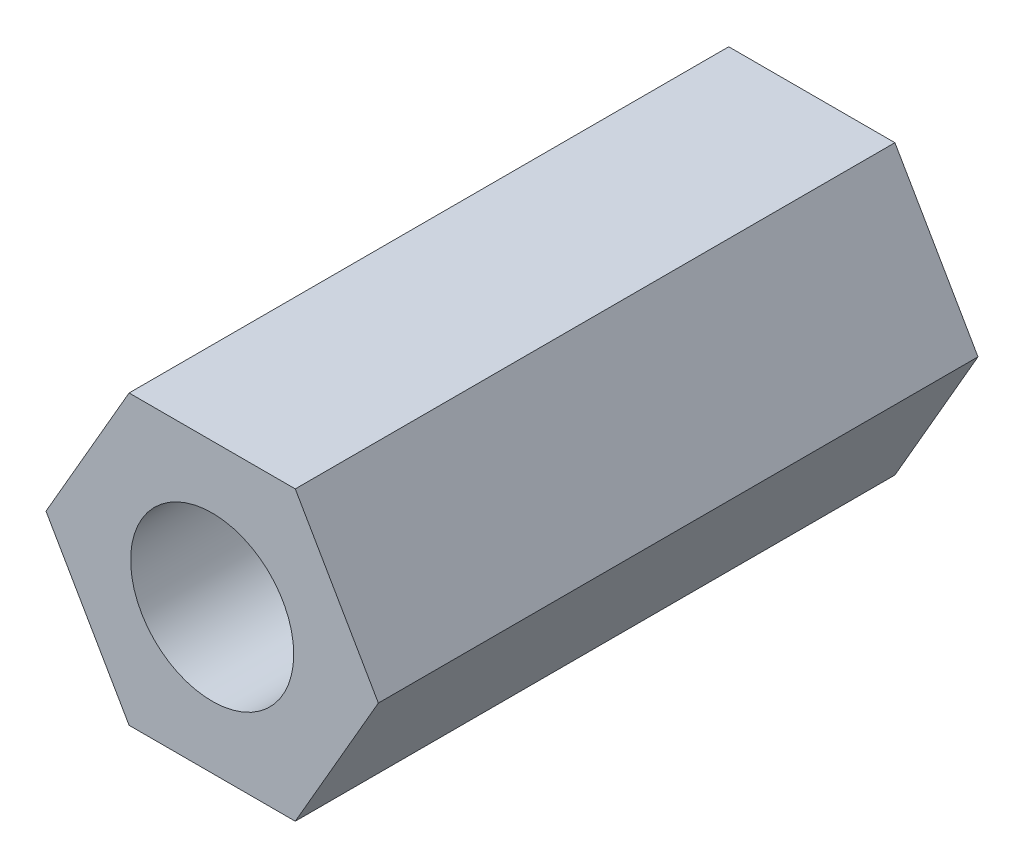
ISO-10303-21;
HEADER;
FILE_DESCRIPTION(('STEP AP214'),'2;1');
FILE_NAME('part.step','',(''),(''),'','','');
FILE_SCHEMA(('AUTOMOTIVE_DESIGN { 1 0 10303 214 1 1 1 1 }'));
ENDSEC;
DATA;
#1=APPLICATION_CONTEXT('core data for automotive mechanical design processes');
#2=APPLICATION_PROTOCOL_DEFINITION('international standard','automotive_design',2000,#1);
#3=PRODUCT_CONTEXT('',#1,'mechanical');
#4=PRODUCT('Part','Part','',(#3));
#5=PRODUCT_RELATED_PRODUCT_CATEGORY('part','',(#4));
#6=PRODUCT_DEFINITION_FORMATION('','',#4);
#7=PRODUCT_DEFINITION_CONTEXT('part definition',#1,'design');
#8=PRODUCT_DEFINITION('design','',#6,#7);
#9=PRODUCT_DEFINITION_SHAPE('','',#8);
#10=(LENGTH_UNIT() NAMED_UNIT(*) SI_UNIT(.MILLI.,.METRE.));
#11=(NAMED_UNIT(*) PLANE_ANGLE_UNIT() SI_UNIT($,.RADIAN.));
#12=(NAMED_UNIT(*) SI_UNIT($,.STERADIAN.) SOLID_ANGLE_UNIT());
#13=UNCERTAINTY_MEASURE_WITH_UNIT(LENGTH_MEASURE(1.E-05),#10,'distance_accuracy_value','');
#14=(GEOMETRIC_REPRESENTATION_CONTEXT(3) GLOBAL_UNCERTAINTY_ASSIGNED_CONTEXT((#13)) GLOBAL_UNIT_ASSIGNED_CONTEXT((#10,
#11,#12)) REPRESENTATION_CONTEXT('',''));
#15=CARTESIAN_POINT('',(0.,0.,0.));
#16=DIRECTION('',(0.,0.,1.));
#17=DIRECTION('',(1.,0.,0.));
#18=AXIS2_PLACEMENT_3D('',#15,#16,#17);
#19=CARTESIAN_POINT('',(3.46410161513775,-6.,-25.));
#20=DIRECTION('',(0.866025403784438,-0.5,0.));
#21=DIRECTION('',(0.5,0.866025403784439,0.));
#22=AXIS2_PLACEMENT_3D('',#19,#20,#21);
#23=PLANE('',#22);
#24=DIRECTION('',(0.5,0.866025403784438,0.));
#25=VECTOR('',#24,1.);
#26=CARTESIAN_POINT('',(3.46410161513775,-6.,0.));
#27=LINE('',#26,#25);
#28=CARTESIAN_POINT('',(3.46410161513775,-6.,0.));
#29=VERTEX_POINT('',#28);
#30=CARTESIAN_POINT('',(6.92820323027551,0.,0.));
#31=VERTEX_POINT('',#30);
#32=EDGE_CURVE('E131',#29,#31,#27,.T.);
#33=ORIENTED_EDGE('',*,*,#32,.F.);
#34=DIRECTION('',(0.,0.,1.));
#35=VECTOR('',#34,1.);
#36=CARTESIAN_POINT('',(3.46410161513775,-6.,-25.));
#37=LINE('',#36,#35);
#38=CARTESIAN_POINT('',(3.46410161513775,-6.,-25.));
#39=VERTEX_POINT('',#38);
#40=EDGE_CURVE('E11',#39,#29,#37,.T.);
#41=ORIENTED_EDGE('',*,*,#40,.F.);
#42=DIRECTION('',(0.5,0.866025403784438,0.));
#43=VECTOR('',#42,1.);
#44=CARTESIAN_POINT('',(3.46410161513775,-6.,-25.));
#45=LINE('',#44,#43);
#46=CARTESIAN_POINT('',(6.92820323027551,0.,-25.));
#47=VERTEX_POINT('',#46);
#48=EDGE_CURVE('E152',#39,#47,#45,.T.);
#49=ORIENTED_EDGE('',*,*,#48,.T.);
#50=DIRECTION('',(0.,0.,1.));
#51=VECTOR('',#50,1.);
#52=CARTESIAN_POINT('',(6.92820323027551,0.,-25.));
#53=LINE('',#52,#51);
#54=EDGE_CURVE('E43',#47,#31,#53,.T.);
#55=ORIENTED_EDGE('',*,*,#54,.T.);
#56=EDGE_LOOP('',(#33,#41,#49,#55));
#57=FACE_BOUND('',#56,.T.);
#58=ADVANCED_FACE('F40',(#57),#23,.T.);
#59=CARTESIAN_POINT('',(-3.46410161513775,-6.,-25.));
#60=DIRECTION('',(0.,-1.,0.));
#61=DIRECTION('',(0.,0.,-1.));
#62=AXIS2_PLACEMENT_3D('',#59,#60,#61);
#63=PLANE('',#62);
#64=DIRECTION('',(1.,0.,0.));
#65=VECTOR('',#64,1.);
#66=CARTESIAN_POINT('',(-3.46410161513775,-6.,0.));
#67=LINE('',#66,#65);
#68=CARTESIAN_POINT('',(-3.46410161513775,-6.,0.));
#69=VERTEX_POINT('',#68);
#70=EDGE_CURVE('E149',#69,#29,#67,.T.);
#71=ORIENTED_EDGE('',*,*,#70,.F.);
#72=DIRECTION('',(0.,0.,1.));
#73=VECTOR('',#72,1.);
#74=CARTESIAN_POINT('',(-3.46410161513775,-6.,-25.));
#75=LINE('',#74,#73);
#76=CARTESIAN_POINT('',(-3.46410161513775,-6.,-25.));
#77=VERTEX_POINT('',#76);
#78=EDGE_CURVE('E50',#77,#69,#75,.T.);
#79=ORIENTED_EDGE('',*,*,#78,.F.);
#80=DIRECTION('',(1.,0.,0.));
#81=VECTOR('',#80,1.);
#82=CARTESIAN_POINT('',(-3.46410161513775,-6.,-25.));
#83=LINE('',#82,#81);
#84=EDGE_CURVE('E117',#77,#39,#83,.T.);
#85=ORIENTED_EDGE('',*,*,#84,.T.);
#86=ORIENTED_EDGE('',*,*,#40,.T.);
#87=EDGE_LOOP('',(#71,#79,#85,#86));
#88=FACE_BOUND('',#87,.T.);
#89=ADVANCED_FACE('F164',(#88),#63,.T.);
#90=CARTESIAN_POINT('',(-6.92820323027551,0.,-25.));
#91=DIRECTION('',(-0.866025403784438,-0.5,0.));
#92=DIRECTION('',(0.5,-0.866025403784439,0.));
#93=AXIS2_PLACEMENT_3D('',#90,#91,#92);
#94=PLANE('',#93);
#95=DIRECTION('',(0.5,-0.866025403784438,0.));
#96=VECTOR('',#95,1.);
#97=CARTESIAN_POINT('',(-6.92820323027551,0.,0.));
#98=LINE('',#97,#96);
#99=CARTESIAN_POINT('',(-6.92820323027551,0.,0.));
#100=VERTEX_POINT('',#99);
#101=EDGE_CURVE('E103',#100,#69,#98,.T.);
#102=ORIENTED_EDGE('',*,*,#101,.F.);
#103=DIRECTION('',(0.,0.,1.));
#104=VECTOR('',#103,1.);
#105=CARTESIAN_POINT('',(-6.92820323027551,0.,-25.));
#106=LINE('',#105,#104);
#107=CARTESIAN_POINT('',(-6.92820323027551,0.,-25.));
#108=VERTEX_POINT('',#107);
#109=EDGE_CURVE('E98',#108,#100,#106,.T.);
#110=ORIENTED_EDGE('',*,*,#109,.F.);
#111=DIRECTION('',(0.5,-0.866025403784438,0.));
#112=VECTOR('',#111,1.);
#113=CARTESIAN_POINT('',(-6.92820323027551,0.,-25.));
#114=LINE('',#113,#112);
#115=EDGE_CURVE('E101',#108,#77,#114,.T.);
#116=ORIENTED_EDGE('',*,*,#115,.T.);
#117=ORIENTED_EDGE('',*,*,#78,.T.);
#118=EDGE_LOOP('',(#102,#110,#116,#117));
#119=FACE_BOUND('',#118,.T.);
#120=ADVANCED_FACE('F100',(#119),#94,.T.);
#121=CARTESIAN_POINT('',(-3.46410161513776,6.,-25.));
#122=DIRECTION('',(-0.866025403784439,0.5,0.));
#123=DIRECTION('',(-0.5,-0.866025403784439,0.));
#124=AXIS2_PLACEMENT_3D('',#121,#122,#123);
#125=PLANE('',#124);
#126=DIRECTION('',(-0.5,-0.866025403784439,0.));
#127=VECTOR('',#126,1.);
#128=CARTESIAN_POINT('',(-3.46410161513776,6.,0.));
#129=LINE('',#128,#127);
#130=CARTESIAN_POINT('',(-3.46410161513776,6.,0.));
#131=VERTEX_POINT('',#130);
#132=EDGE_CURVE('E144',#131,#100,#129,.T.);
#133=ORIENTED_EDGE('',*,*,#132,.F.);
#134=DIRECTION('',(0.,0.,1.));
#135=VECTOR('',#134,1.);
#136=CARTESIAN_POINT('',(-3.46410161513776,6.,-25.));
#137=LINE('',#136,#135);
#138=CARTESIAN_POINT('',(-3.46410161513776,6.,-25.));
#139=VERTEX_POINT('',#138);
#140=EDGE_CURVE('E109',#139,#131,#137,.T.);
#141=ORIENTED_EDGE('',*,*,#140,.F.);
#142=DIRECTION('',(-0.5,-0.866025403784439,0.));
#143=VECTOR('',#142,1.);
#144=CARTESIAN_POINT('',(-3.46410161513776,6.,-25.));
#145=LINE('',#144,#143);
#146=EDGE_CURVE('E115',#139,#108,#145,.T.);
#147=ORIENTED_EDGE('',*,*,#146,.T.);
#148=ORIENTED_EDGE('',*,*,#109,.T.);
#149=EDGE_LOOP('',(#133,#141,#147,#148));
#150=FACE_BOUND('',#149,.T.);
#151=ADVANCED_FACE('F120',(#150),#125,.T.);
#152=CARTESIAN_POINT('',(3.46410161513775,6.,-25.));
#153=DIRECTION('',(0.,1.,0.));
#154=DIRECTION('',(0.,0.,1.));
#155=AXIS2_PLACEMENT_3D('',#152,#153,#154);
#156=PLANE('',#155);
#157=DIRECTION('',(-1.,0.,0.));
#158=VECTOR('',#157,1.);
#159=CARTESIAN_POINT('',(3.46410161513775,6.,0.));
#160=LINE('',#159,#158);
#161=CARTESIAN_POINT('',(3.46410161513775,6.,0.));
#162=VERTEX_POINT('',#161);
#163=EDGE_CURVE('E140',#162,#131,#160,.T.);
#164=ORIENTED_EDGE('',*,*,#163,.F.);
#165=DIRECTION('',(0.,0.,1.));
#166=VECTOR('',#165,1.);
#167=CARTESIAN_POINT('',(3.46410161513775,6.,-25.));
#168=LINE('',#167,#166);
#169=CARTESIAN_POINT('',(3.46410161513775,6.,-25.));
#170=VERTEX_POINT('',#169);
#171=EDGE_CURVE('E157',#170,#162,#168,.T.);
#172=ORIENTED_EDGE('',*,*,#171,.F.);
#173=DIRECTION('',(-1.,0.,0.));
#174=VECTOR('',#173,1.);
#175=CARTESIAN_POINT('',(3.46410161513775,6.,-25.));
#176=LINE('',#175,#174);
#177=EDGE_CURVE('E122',#170,#139,#176,.T.);
#178=ORIENTED_EDGE('',*,*,#177,.T.);
#179=ORIENTED_EDGE('',*,*,#140,.T.);
#180=EDGE_LOOP('',(#164,#172,#178,#179));
#181=FACE_BOUND('',#180,.T.);
#182=ADVANCED_FACE('F177',(#181),#156,.T.);
#183=CARTESIAN_POINT('',(6.92820323027551,0.,-25.));
#184=DIRECTION('',(0.866025403784438,0.5,0.));
#185=DIRECTION('',(-0.5,0.866025403784439,0.));
#186=AXIS2_PLACEMENT_3D('',#183,#184,#185);
#187=PLANE('',#186);
#188=DIRECTION('',(-0.5,0.866025403784438,0.));
#189=VECTOR('',#188,1.);
#190=CARTESIAN_POINT('',(6.92820323027551,0.,0.));
#191=LINE('',#190,#189);
#192=EDGE_CURVE('E135',#31,#162,#191,.T.);
#193=ORIENTED_EDGE('',*,*,#192,.F.);
#194=ORIENTED_EDGE('',*,*,#54,.F.);
#195=DIRECTION('',(-0.5,0.866025403784438,0.));
#196=VECTOR('',#195,1.);
#197=CARTESIAN_POINT('',(6.92820323027551,0.,-25.));
#198=LINE('',#197,#196);
#199=EDGE_CURVE('E125',#47,#170,#198,.T.);
#200=ORIENTED_EDGE('',*,*,#199,.T.);
#201=ORIENTED_EDGE('',*,*,#171,.T.);
#202=EDGE_LOOP('',(#193,#194,#200,#201));
#203=FACE_BOUND('',#202,.T.);
#204=ADVANCED_FACE('F161',(#203),#187,.T.);
#205=CARTESIAN_POINT('',(0.,0.,-25.));
#206=DIRECTION('',(0.,0.,1.));
#207=DIRECTION('',(1.,0.,0.));
#208=AXIS2_PLACEMENT_3D('',#205,#206,#207);
#209=PLANE('',#208);
#210=CARTESIAN_POINT('',(0.,0.,-25.));
#211=DIRECTION('',(0.,0.,1.));
#212=DIRECTION('',(1.,0.,0.));
#213=AXIS2_PLACEMENT_3D('',#210,#211,#212);
#214=CIRCLE('',#213,3.39999999999999);
#215=CARTESIAN_POINT('',(3.39999999999999,0.,-25.));
#216=VERTEX_POINT('',#215);
#217=EDGE_CURVE('E136',#216,#216,#214,.T.);
#218=ORIENTED_EDGE('',*,*,#217,.T.);
#219=EDGE_LOOP('',(#218));
#220=FACE_BOUND('',#219,.T.);
#221=ORIENTED_EDGE('',*,*,#48,.F.);
#222=ORIENTED_EDGE('',*,*,#84,.F.);
#223=ORIENTED_EDGE('',*,*,#115,.F.);
#224=ORIENTED_EDGE('',*,*,#146,.F.);
#225=ORIENTED_EDGE('',*,*,#177,.F.);
#226=ORIENTED_EDGE('',*,*,#199,.F.);
#227=EDGE_LOOP('',(#221,#222,#223,#224,#225,#226));
#228=FACE_BOUND('',#227,.T.);
#229=ADVANCED_FACE('F113',(#220,#228),#209,.F.);
#230=CARTESIAN_POINT('',(0.,0.,0.));
#231=DIRECTION('',(0.,0.,1.));
#232=DIRECTION('',(1.,0.,0.));
#233=AXIS2_PLACEMENT_3D('',#230,#231,#232);
#234=PLANE('',#233);
#235=CARTESIAN_POINT('',(0.,0.,0.));
#236=DIRECTION('',(0.,0.,1.));
#237=DIRECTION('',(1.,0.,0.));
#238=AXIS2_PLACEMENT_3D('',#235,#236,#237);
#239=CIRCLE('',#238,3.4);
#240=CARTESIAN_POINT('',(3.4,0.,0.));
#241=VERTEX_POINT('',#240);
#242=EDGE_CURVE('E200',#241,#241,#239,.T.);
#243=ORIENTED_EDGE('',*,*,#242,.F.);
#244=EDGE_LOOP('',(#243));
#245=FACE_BOUND('',#244,.T.);
#246=ORIENTED_EDGE('',*,*,#32,.T.);
#247=ORIENTED_EDGE('',*,*,#192,.T.);
#248=ORIENTED_EDGE('',*,*,#163,.T.);
#249=ORIENTED_EDGE('',*,*,#132,.T.);
#250=ORIENTED_EDGE('',*,*,#101,.T.);
#251=ORIENTED_EDGE('',*,*,#70,.T.);
#252=EDGE_LOOP('',(#246,#247,#248,#249,#250,#251));
#253=FACE_BOUND('',#252,.T.);
#254=ADVANCED_FACE('F163',(#245,#253),#234,.T.);
#255=CARTESIAN_POINT('',(0.,0.,0.));
#256=DIRECTION('',(0.,0.,1.));
#257=DIRECTION('',(1.,0.,0.));
#258=AXIS2_PLACEMENT_3D('',#255,#256,#257);
#259=CYLINDRICAL_SURFACE('',#258,3.4);
#260=ORIENTED_EDGE('',*,*,#217,.F.);
#261=EDGE_LOOP('',(#260));
#262=FACE_BOUND('',#261,.T.);
#263=ORIENTED_EDGE('',*,*,#242,.T.);
#264=EDGE_LOOP('',(#263));
#265=FACE_BOUND('',#264,.T.);
#266=ADVANCED_FACE('F188',(#262,#265),#259,.F.);
#267=CLOSED_SHELL('',(#58,#89,#120,#151,#182,#204,#229,#254,#266));
#268=MANIFOLD_SOLID_BREP('B2',#267);
#269=ADVANCED_BREP_SHAPE_REPRESENTATION('',(#18,#268),#14);
#270=SHAPE_DEFINITION_REPRESENTATION(#9,#269);
ENDSEC;
END-ISO-10303-21;
